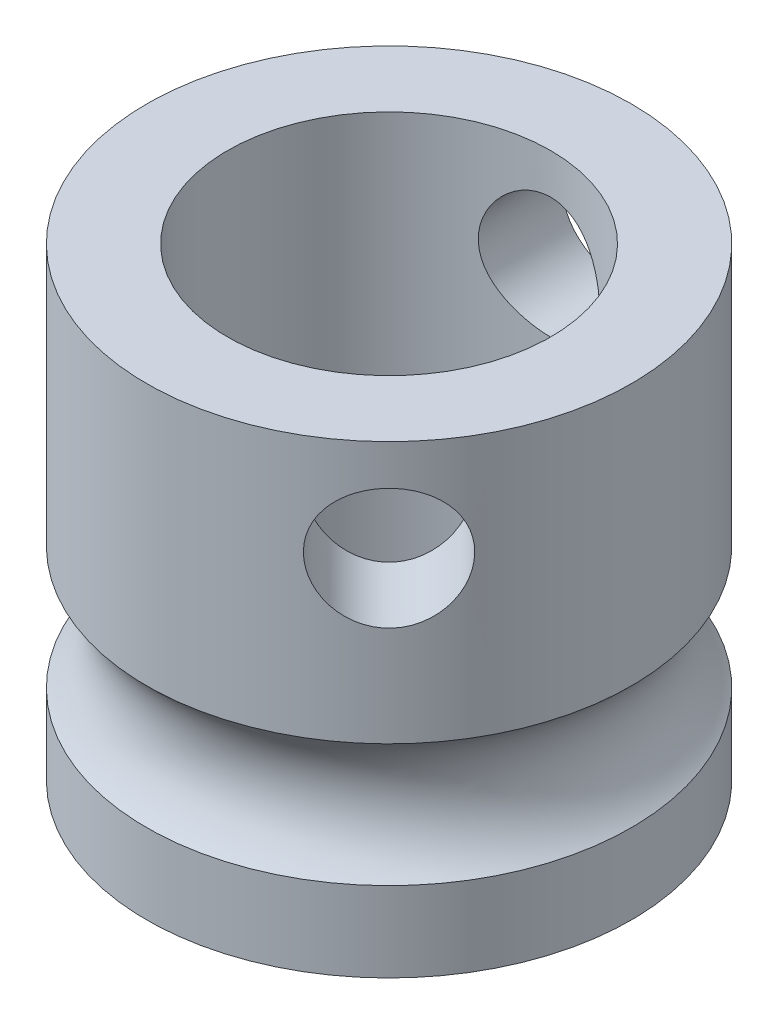
ISO-10303-21;
HEADER;
FILE_DESCRIPTION(('STEP AP214'),'2;1');
FILE_NAME('part.step','',(''),(''),'','','');
FILE_SCHEMA(('AUTOMOTIVE_DESIGN { 1 0 10303 214 1 1 1 1 }'));
ENDSEC;
DATA;
#1=APPLICATION_CONTEXT('core data for automotive mechanical design processes');
#2=APPLICATION_PROTOCOL_DEFINITION('international standard','automotive_design',2000,#1);
#3=PRODUCT_CONTEXT('',#1,'mechanical');
#4=PRODUCT('Part','Part','',(#3));
#5=PRODUCT_RELATED_PRODUCT_CATEGORY('part','',(#4));
#6=PRODUCT_DEFINITION_FORMATION('','',#4);
#7=PRODUCT_DEFINITION_CONTEXT('part definition',#1,'design');
#8=PRODUCT_DEFINITION('design','',#6,#7);
#9=PRODUCT_DEFINITION_SHAPE('','',#8);
#10=(LENGTH_UNIT() NAMED_UNIT(*) SI_UNIT(.MILLI.,.METRE.));
#11=(NAMED_UNIT(*) PLANE_ANGLE_UNIT() SI_UNIT($,.RADIAN.));
#12=(NAMED_UNIT(*) SI_UNIT($,.STERADIAN.) SOLID_ANGLE_UNIT());
#13=UNCERTAINTY_MEASURE_WITH_UNIT(LENGTH_MEASURE(1.E-05),#10,'distance_accuracy_value','');
#14=(GEOMETRIC_REPRESENTATION_CONTEXT(3) GLOBAL_UNCERTAINTY_ASSIGNED_CONTEXT((#13)) GLOBAL_UNIT_ASSIGNED_CONTEXT((#10,
#11,#12)) REPRESENTATION_CONTEXT('',''));
#15=CARTESIAN_POINT('',(0.,0.,0.));
#16=DIRECTION('',(0.,0.,1.));
#17=DIRECTION('',(1.,0.,0.));
#18=AXIS2_PLACEMENT_3D('',#15,#16,#17);
#19=CARTESIAN_POINT('',(0.,0.,0.));
#20=DIRECTION('',(0.,-1.,0.));
#21=DIRECTION('',(0.,0.,-1.));
#22=AXIS2_PLACEMENT_3D('',#19,#20,#21);
#23=CYLINDRICAL_SURFACE('',#22,4.);
#24=CARTESIAN_POINT('',(0.,8.,0.));
#25=DIRECTION('',(0.,-1.,0.));
#26=DIRECTION('',(0.,0.,-1.));
#27=AXIS2_PLACEMENT_3D('',#24,#25,#26);
#28=CIRCLE('',#27,4.);
#29=CARTESIAN_POINT('',(0.,8.,-4.));
#30=VERTEX_POINT('',#29);
#31=EDGE_CURVE('E65',#30,#30,#28,.T.);
#32=ORIENTED_EDGE('',*,*,#31,.F.);
#33=EDGE_LOOP('',(#32));
#34=FACE_BOUND('',#33,.T.);
#35=CARTESIAN_POINT('',(0.,7.,-4.));
#36=CARTESIAN_POINT('',(-0.0812350589378529,7.00000290230311,-4.00000217456151));
#37=CARTESIAN_POINT('',(-0.162450241781792,6.99338023975162,-3.99750379283184));
#38=CARTESIAN_POINT('',(-0.322453452352361,6.96717180473007,-3.98778696006928));
#39=CARTESIAN_POINT('',(-0.401241827987616,6.94758789952943,-3.98056918893993));
#40=CARTESIAN_POINT('',(-0.554060784990879,6.89624699822824,-3.96218832391545));
#41=CARTESIAN_POINT('',(-0.628100224162277,6.86451348317821,-3.9510328434944));
#42=CARTESIAN_POINT('',(-0.769799310160253,6.78989358698418,-3.92588767765353));
#43=CARTESIAN_POINT('',(-0.837457239177879,6.74700421445584,-3.91189723227548));
#44=CARTESIAN_POINT('',(-0.967346417045826,6.64938746892909,-3.88186246971217));
#45=CARTESIAN_POINT('',(-1.02927073015119,6.5942697377406,-3.86576002583566));
#46=CARTESIAN_POINT('',(-1.14324421474363,6.47458956534116,-3.83360220871327));
#47=CARTESIAN_POINT('',(-1.19529036359203,6.41002424391213,-3.81754685135033));
#48=CARTESIAN_POINT('',(-1.28998202215985,6.27028253247679,-3.78662470617731));
#49=CARTESIAN_POINT('',(-1.3321939319576,6.19479563345418,-3.77182648820818));
#50=CARTESIAN_POINT('',(-1.40318646334084,6.03715164583148,-3.74599860237433));
#51=CARTESIAN_POINT('',(-1.43197244961239,5.9549972368449,-3.73496742975881));
#52=CARTESIAN_POINT('',(-1.47408431017549,5.7898832597418,-3.71854412824136));
#53=CARTESIAN_POINT('',(-1.48799593218558,5.70709496156456,-3.71293924350838));
#54=CARTESIAN_POINT('',(-1.50179556531648,5.54018384200616,-3.70738061461215));
#55=CARTESIAN_POINT('',(-1.50168936802631,5.45606158612553,-3.70742453659305));
#56=CARTESIAN_POINT('',(-1.48790429610018,5.29423047478704,-3.71297511632055));
#57=CARTESIAN_POINT('',(-1.47503808509003,5.21643909395582,-3.71815468871122));
#58=CARTESIAN_POINT('',(-1.4374416786833,5.06421284959468,-3.73284938059529));
#59=CARTESIAN_POINT('',(-1.41270969663258,4.98977849338612,-3.74236515298863));
#60=CARTESIAN_POINT('',(-1.35163748571904,4.84472293227177,-3.76485702190253));
#61=CARTESIAN_POINT('',(-1.31508648737101,4.7742005138787,-3.77789517988166));
#62=CARTESIAN_POINT('',(-1.23156073762698,4.64005426240903,-3.80594210139319));
#63=CARTESIAN_POINT('',(-1.18458238728897,4.5764328224803,-3.82095154457158));
#64=CARTESIAN_POINT('',(-1.07781780766549,4.45339633634912,-3.85248038859113));
#65=CARTESIAN_POINT('',(-1.01738298716955,4.39455135925191,-3.86903347455671));
#66=CARTESIAN_POINT('',(-0.88731259081902,4.2876620337942,-3.90091728164085));
#67=CARTESIAN_POINT('',(-0.817675603497363,4.23961934539433,-3.91624781465952));
#68=CARTESIAN_POINT('',(-0.669723436992419,4.15506960293748,-3.9442639480908));
#69=CARTESIAN_POINT('',(-0.591290713844718,4.11875241877894,-3.95690498259616));
#70=CARTESIAN_POINT('',(-0.428836850524582,4.06001739572996,-3.97778718326962));
#71=CARTESIAN_POINT('',(-0.344818210845766,4.03759338343888,-3.98603030341493));
#72=CARTESIAN_POINT('',(-0.178375243148664,4.00837721245806,-3.99684443228065));
#73=CARTESIAN_POINT('',(-0.0961036195622086,4.00081739361749,-3.99969369025686));
#74=CARTESIAN_POINT('',(0.0685724752550249,3.99930893610008,-4.00025893700126));
#75=CARTESIAN_POINT('',(0.150976912983373,4.00535727968322,-3.99797606386863));
#76=CARTESIAN_POINT('',(0.31026204856186,4.03031004230867,-3.98871709772643));
#77=CARTESIAN_POINT('',(0.387233328007337,4.04871154373709,-3.98192470962305));
#78=CARTESIAN_POINT('',(0.536941754957222,4.09718607254732,-3.96451477091717));
#79=CARTESIAN_POINT('',(0.609678350347535,4.12726061794804,-3.9538967228203));
#80=CARTESIAN_POINT('',(0.751247765110156,4.19918641243947,-3.92949624407681));
#81=CARTESIAN_POINT('',(0.819903083557796,4.24135772922339,-3.91563000209348));
#82=CARTESIAN_POINT('',(0.949392711726626,4.33591810317156,-3.88626671564664));
#83=CARTESIAN_POINT('',(1.01022412027045,4.38831093254515,-3.87076907009516));
#84=CARTESIAN_POINT('',(1.12603079874454,4.50540412212428,-3.8387332949099));
#85=CARTESIAN_POINT('',(1.18046154123569,4.5706421827727,-3.82218696503729));
#86=CARTESIAN_POINT('',(1.27771050031903,4.70965138470766,-3.79078815746854));
#87=CARTESIAN_POINT('',(1.32052767414518,4.7834232913885,-3.77593583194399));
#88=CARTESIAN_POINT('',(1.39337773518998,4.93801598677231,-3.74966829822463));
#89=CARTESIAN_POINT('',(1.42335685446918,5.01886474591044,-3.73826760328493));
#90=CARTESIAN_POINT('',(1.46907883466889,5.18500976368782,-3.72054032891005));
#91=CARTESIAN_POINT('',(1.48483050305535,5.27030323619812,-3.71421061057491));
#92=CARTESIAN_POINT('',(1.50086347097839,5.43701615954111,-3.70775894792573));
#93=CARTESIAN_POINT('',(1.50207331495837,5.51833263171688,-3.70726444523341));
#94=CARTESIAN_POINT('',(1.49136715641593,5.67994531627616,-3.71158412745292));
#95=CARTESIAN_POINT('',(1.47945239850124,5.76024162467158,-3.71639780898899));
#96=CARTESIAN_POINT('',(1.44355815630242,5.91504722671655,-3.73048141585432));
#97=CARTESIAN_POINT('',(1.41995798316524,5.98965834624535,-3.73961085376663));
#98=CARTESIAN_POINT('',(1.3616969677992,6.13390550849442,-3.76121548297845));
#99=CARTESIAN_POINT('',(1.32703332944945,6.20354028807014,-3.77369151995215));
#100=CARTESIAN_POINT('',(1.24552075938154,6.33982678969763,-3.80139723903965));
#101=CARTESIAN_POINT('',(1.1981283280301,6.40613079679991,-3.81673698440964));
#102=CARTESIAN_POINT('',(1.09334485729906,6.5301415609712,-3.84806246757177));
#103=CARTESIAN_POINT('',(1.03595064012808,6.58784557478675,-3.86404840943145));
#104=CARTESIAN_POINT('',(0.909080396784622,6.69620195582184,-3.89590424609881));
#105=CARTESIAN_POINT('',(0.839118644212991,6.74630375343467,-3.91172104900645));
#106=CARTESIAN_POINT('',(0.691213223200819,6.83402265527656,-3.94054514457031));
#107=CARTESIAN_POINT('',(0.61326893409062,6.87163878773637,-3.95355221851559));
#108=CARTESIAN_POINT('',(0.447999082002311,6.93437682904833,-3.9757429260668));
#109=CARTESIAN_POINT('',(0.360413422234208,6.9588870646019,-3.98473657158356));
#110=CARTESIAN_POINT('',(0.181875733606382,6.99169295992068,-3.99686242179587));
#111=CARTESIAN_POINT('',(0.0909254163648591,6.99999675148732,-3.99999756603967));
#112=CARTESIAN_POINT('',(0.,7.,-4.));
#113=B_SPLINE_CURVE_WITH_KNOTS('',3,(#35,#36,#37,#38,#39,#40,#41,#42,#43,#44,#45,#46,#47,#48,
#49,#50,#51,#52,#53,#54,#55,#56,#57,#58,#59,#60,#61,#62,#63,#64,#65,#66,#67,#68,#69,#70,#71,#72,
#73,#74,#75,#76,#77,#78,#79,#80,#81,#82,#83,#84,#85,#86,#87,#88,#89,#90,#91,#92,#93,#94,#95,#96,
#97,#98,#99,#100,#101,#102,#103,#104,#105,#106,#107,#108,#109,#110,#111,#112),.UNSPECIFIED.,.T.,
.F.,(4,2,2,2,2,2,2,2,2,2,2,2,2,2,2,2,2,2,2,2,2,2,2,2,2,2,2,2,2,2,2,2,2,2,2,2,2,2,4),(0.,
0.24336980156056,0.486704549530461,0.729571369213573,0.97250337960949,1.22473618582715,
1.47704604925622,1.73896674501659,2.00078269352134,2.25185874416902,2.50283106079707,
2.73878345119971,2.97477138060589,3.21522408387018,3.45575990744258,3.71246153335813,
3.96920257905066,4.22991375286075,4.49050899698846,4.73725019635925,4.98393668390521,
5.2211443792384,5.45838293254454,5.702592218596,5.94689180019868,6.20536519455658,
6.46386178920141,6.72343066727204,6.98283874956507,7.22558763480252,7.46831350211259,
7.70363142426534,7.93900886656507,8.18672471884271,8.43451941997062,8.69572329654039,
8.95694749805102,9.22948515032042,9.50188601796127),.UNSPECIFIED.);
#114=CARTESIAN_POINT('',(0.,7.,-4.));
#115=VERTEX_POINT('',#114);
#116=EDGE_CURVE('E68',#115,#115,#113,.T.);
#117=ORIENTED_EDGE('',*,*,#116,.F.);
#118=EDGE_LOOP('',(#117));
#119=FACE_BOUND('',#118,.T.);
#120=CARTESIAN_POINT('',(1.56136194864554,5.5,3.68268229220521));
#121=CARTESIAN_POINT('',(1.56135779208035,5.58100748372079,3.68268243634986));
#122=CARTESIAN_POINT('',(1.56791497826831,5.66199492250364,3.67992410507783));
#123=CARTESIAN_POINT('',(1.59367706127285,5.8215280829132,3.66884013139985));
#124=CARTESIAN_POINT('',(1.6128815792934,5.90007387759501,3.66051465573348));
#125=CARTESIAN_POINT('',(1.66266134710063,6.05237537161353,3.63817143026194));
#126=CARTESIAN_POINT('',(1.69320934739937,6.12614205665108,3.6241673144158));
#127=CARTESIAN_POINT('',(1.76402832005993,6.26737189681884,3.59022855145938));
#128=CARTESIAN_POINT('',(1.80430221263119,6.33483315028252,3.5702921227477));
#129=CARTESIAN_POINT('',(1.89474150454269,6.46489031162282,3.52316120631594));
#130=CARTESIAN_POINT('',(1.94527169042746,6.52712852962939,3.49567941002739));
#131=CARTESIAN_POINT('',(2.05280287486073,6.64172281467149,3.43363511372078));
#132=CARTESIAN_POINT('',(2.10980524955819,6.69407677374186,3.39907110658607));
#133=CARTESIAN_POINT('',(2.23009746766653,6.78913951229561,3.32143851502955));
#134=CARTESIAN_POINT('',(2.29353525591582,6.83145947471586,3.2781205633425));
#135=CARTESIAN_POINT('',(2.42242359918014,6.90265117252491,3.18405647598774));
#136=CARTESIAN_POINT('',(2.4878734477221,6.93152757199197,3.1333129245826));
#137=CARTESIAN_POINT('',(2.61537417527733,6.97375789577462,3.02760235556394));
#138=CARTESIAN_POINT('',(2.67744989555346,6.98772762744046,2.97291191464347));
#139=CARTESIAN_POINT('',(2.79885293324627,7.00172120094499,2.85890661244243));
#140=CARTESIAN_POINT('',(2.85818113809423,7.00174957761871,2.79959326117797));
#141=CARTESIAN_POINT('',(2.96937910498948,6.98821823853483,2.68124222314178));
#142=CARTESIAN_POINT('',(3.0214726487727,6.97533070205119,2.62233607452958));
#143=CARTESIAN_POINT('',(3.12030098191268,6.93746408477445,2.5039312488251));
#144=CARTESIAN_POINT('',(3.1670353915079,6.91248414773796,2.44443253006613));
#145=CARTESIAN_POINT('',(3.25507181620702,6.85082954832415,2.32594903760683));
#146=CARTESIAN_POINT('',(3.29628488300286,6.81398999473159,2.26698434219066));
#147=CARTESIAN_POINT('',(3.37219203456641,6.72980790307061,2.15245177622769));
#148=CARTESIAN_POINT('',(3.40688400977845,6.6824619769824,2.09688500881012));
#149=CARTESIAN_POINT('',(3.47162261343371,6.57537271371681,1.98798461884326));
#150=CARTESIAN_POINT('',(3.50127867151368,6.51506608434957,1.93497189192805));
#151=CARTESIAN_POINT('',(3.55358532534339,6.38540700667844,1.8371487304959));
#152=CARTESIAN_POINT('',(3.57623416220865,6.31605229341336,1.79234035650606));
#153=CARTESIAN_POINT('',(3.61528363828264,6.16828053253718,1.71223850580146));
#154=CARTESIAN_POINT('',(3.63153443487212,6.08969650631393,1.67717829618631));
#155=CARTESIAN_POINT('',(3.65736064786832,5.92690377483243,1.62009459026146));
#156=CARTESIAN_POINT('',(3.66693977917435,5.84269822840631,1.59806383995466));
#157=CARTESIAN_POINT('',(3.67928722207547,5.67602403768405,1.56941929718694));
#158=CARTESIAN_POINT('',(3.68240215096391,5.59371589446386,1.56202196019031));
#159=CARTESIAN_POINT('',(3.68292624974755,5.42899064325826,1.56078727966911));
#160=CARTESIAN_POINT('',(3.68033684547876,5.34657356764753,1.56694654758067));
#161=CARTESIAN_POINT('',(3.6696658054887,5.18807007771232,1.59176558688802));
#162=CARTESIAN_POINT('',(3.66185071568455,5.11186886423534,1.60981809211476));
#163=CARTESIAN_POINT('',(3.64086638246479,4.9636520552798,1.65672794151804));
#164=CARTESIAN_POINT('',(3.62769604205964,4.89163732083186,1.6855874993558));
#165=CARTESIAN_POINT('',(3.59518921978222,4.75083556192379,1.75387902817586));
#166=CARTESIAN_POINT('',(3.57564011209578,4.68227070786266,1.79366674499548));
#167=CARTESIAN_POINT('',(3.53025982383456,4.55287101827396,1.88140959407388));
#168=CARTESIAN_POINT('',(3.50442634320998,4.49203902537537,1.92936771473035));
#169=CARTESIAN_POINT('',(3.44435800648028,4.3758316268049,2.03477268299013));
#170=CARTESIAN_POINT('',(3.40969437951775,4.32104659123125,2.09262832065705));
#171=CARTESIAN_POINT('',(3.33280371988308,4.22316163241056,2.21303299667708));
#172=CARTESIAN_POINT('',(3.29057666268625,4.18006174705416,2.27558205024835));
#173=CARTESIAN_POINT('',(3.19892716834268,4.10705394380039,2.40270183937087));
#174=CARTESIAN_POINT('',(3.14953014519998,4.0771008762074,2.46726482700423));
#175=CARTESIAN_POINT('',(3.04421932386557,4.03134358615008,2.59608066085983));
#176=CARTESIAN_POINT('',(2.98830860215069,4.0155327145776,2.66033363868844));
#177=CARTESIAN_POINT('',(2.87482723021146,3.99922559724517,2.78242875941168));
#178=CARTESIAN_POINT('',(2.81754322507732,3.99789051694101,2.84042628671861));
#179=CARTESIAN_POINT('',(2.70017358995767,4.00841515944539,2.95222432848033));
#180=CARTESIAN_POINT('',(2.64008829870139,4.02027329088586,3.0060253482812));
#181=CARTESIAN_POINT('',(2.52059713080318,4.05625885149362,3.10685688591615));
#182=CARTESIAN_POINT('',(2.46121043901646,4.08007990587836,3.1540205549749));
#183=CARTESIAN_POINT('',(2.34360810233065,4.13901001338436,3.24236270335427));
#184=CARTESIAN_POINT('',(2.28539268132715,4.17412120330475,3.28354004754419));
#185=CARTESIAN_POINT('',(2.16966241000934,4.25631394350481,3.3611941551591));
#186=CARTESIAN_POINT('',(2.11227987888107,4.30383664051415,3.39740056082675));
#187=CARTESIAN_POINT('',(2.00293492071445,4.40880783018761,3.46299353561127));
#188=CARTESIAN_POINT('',(1.95097443900516,4.46625986580788,3.49237766162307));
#189=CARTESIAN_POINT('',(1.85196155991807,4.59306413164506,3.54592373682155));
#190=CARTESIAN_POINT('',(1.80531294795896,4.66288440215431,3.56972821218074));
#191=CARTESIAN_POINT('',(1.72260839471799,4.81041586957333,3.61036726096523));
#192=CARTESIAN_POINT('',(1.68655355244099,4.88812788405348,3.62720111132724));
#193=CARTESIAN_POINT('',(1.6258957557525,5.0529556809754,3.65480978672137));
#194=CARTESIAN_POINT('',(1.60186414851797,5.14033436651178,3.66528662983953));
#195=CARTESIAN_POINT('',(1.56960478615232,5.31848527195579,3.67922048622757));
#196=CARTESIAN_POINT('',(1.56136660484033,5.40925521270999,3.68268213073401));
#197=CARTESIAN_POINT('',(1.56136194864554,5.5,3.68268229220521));
#198=B_SPLINE_CURVE_WITH_KNOTS('',3,(#120,#121,#122,#123,#124,#125,#126,#127,#128,#129,#130,
#131,#132,#133,#134,#135,#136,#137,#138,#139,#140,#141,#142,#143,#144,#145,#146,#147,#148,#149,
#150,#151,#152,#153,#154,#155,#156,#157,#158,#159,#160,#161,#162,#163,#164,#165,#166,#167,#168,
#169,#170,#171,#172,#173,#174,#175,#176,#177,#178,#179,#180,#181,#182,#183,#184,#185,#186,#187,
#188,#189,#190,#191,#192,#193,#194,#195,#196,#197),.UNSPECIFIED.,.T.,.F.,(4,2,2,2,2,2,2,2,2,2,2,
2,2,2,2,2,2,2,2,2,2,2,2,2,2,2,2,2,2,2,2,2,2,2,2,2,2,2,4),(0.,0.24268454141617,0.485361814598855,
0.727459856757031,0.969630679682934,1.22274652401128,1.47591628822983,1.73770072136421,
1.9993942638133,2.24980018489679,2.50012465404857,2.73806472803194,2.97602165263335,
3.21744131210668,3.45893893628976,3.71456675065875,3.97025867827335,4.23162592252966,
4.49284751635474,4.73965657740485,4.98640395388884,5.22143845928199,5.45652113429526,
5.70041561005821,5.94439948466355,6.20385016993624,6.46330169650178,6.72185508890168,
6.98028685560127,7.22365720549936,7.4669982031948,7.7044027400389,7.94185223512831,
8.18928323676987,8.43680270894965,8.69738599542079,8.95799630544243,9.23003178870926,
9.50188762323053),.UNSPECIFIED.);
#199=CARTESIAN_POINT('',(1.56136194864554,5.5,3.68268229220521));
#200=VERTEX_POINT('',#199);
#201=EDGE_CURVE('E51',#200,#200,#198,.T.);
#202=ORIENTED_EDGE('',*,*,#201,.F.);
#203=EDGE_LOOP('',(#202));
#204=FACE_BOUND('',#203,.T.);
#205=CARTESIAN_POINT('',(0.,-3.5,0.));
#206=DIRECTION('',(0.,-1.,0.));
#207=DIRECTION('',(0.,0.,-1.));
#208=AXIS2_PLACEMENT_3D('',#205,#206,#207);
#209=CIRCLE('',#208,4.);
#210=CARTESIAN_POINT('',(0.,-3.5,-4.));
#211=VERTEX_POINT('',#210);
#212=EDGE_CURVE('E128',#211,#211,#209,.T.);
#213=ORIENTED_EDGE('',*,*,#212,.T.);
#214=EDGE_LOOP('',(#213));
#215=FACE_BOUND('',#214,.T.);
#216=ADVANCED_FACE('F47',(#34,#119,#204,#215),#23,.F.);
#217=CARTESIAN_POINT('',(0.,0.,0.));
#218=DIRECTION('',(0.,-1.,0.));
#219=DIRECTION('',(0.,0.,-1.));
#220=AXIS2_PLACEMENT_3D('',#217,#218,#219);
#221=CYLINDRICAL_SURFACE('',#220,6.);
#222=CARTESIAN_POINT('',(0.,-1.51986841535706,0.));
#223=DIRECTION('',(0.,-1.,0.));
#224=DIRECTION('',(0.,0.,-1.));
#225=AXIS2_PLACEMENT_3D('',#222,#223,#224);
#226=CIRCLE('',#225,6.);
#227=CARTESIAN_POINT('',(0.,-1.51986841535706,-6.));
#228=VERTEX_POINT('',#227);
#229=EDGE_CURVE('E96',#228,#228,#226,.T.);
#230=ORIENTED_EDGE('',*,*,#229,.T.);
#231=EDGE_LOOP('',(#230));
#232=FACE_BOUND('',#231,.T.);
#233=CARTESIAN_POINT('',(0.,-3.5,0.));
#234=DIRECTION('',(0.,-1.,0.));
#235=DIRECTION('',(0.,0.,-1.));
#236=AXIS2_PLACEMENT_3D('',#233,#234,#235);
#237=CIRCLE('',#236,6.);
#238=CARTESIAN_POINT('',(0.,-3.5,-6.));
#239=VERTEX_POINT('',#238);
#240=EDGE_CURVE('E130',#239,#239,#237,.T.);
#241=ORIENTED_EDGE('',*,*,#240,.F.);
#242=EDGE_LOOP('',(#241));
#243=FACE_BOUND('',#242,.T.);
#244=ADVANCED_FACE('F87',(#232,#243),#221,.T.);
#245=CARTESIAN_POINT('',(0.,0.,0.));
#246=DIRECTION('',(0.,-1.,0.));
#247=DIRECTION('',(0.,0.,-1.));
#248=AXIS2_PLACEMENT_3D('',#245,#246,#247);
#249=TOROIDAL_SURFACE('',#248,7.3,2.);
#250=ORIENTED_EDGE('',*,*,#229,.F.);
#251=EDGE_LOOP('',(#250));
#252=FACE_BOUND('',#251,.T.);
#253=CARTESIAN_POINT('',(0.,1.51986841535706,0.));
#254=DIRECTION('',(0.,-1.,0.));
#255=DIRECTION('',(0.,0.,-1.));
#256=AXIS2_PLACEMENT_3D('',#253,#254,#255);
#257=CIRCLE('',#256,6.);
#258=CARTESIAN_POINT('',(0.,1.51986841535706,-6.));
#259=VERTEX_POINT('',#258);
#260=EDGE_CURVE('E10',#259,#259,#257,.T.);
#261=ORIENTED_EDGE('',*,*,#260,.T.);
#262=EDGE_LOOP('',(#261));
#263=FACE_BOUND('',#262,.T.);
#264=ADVANCED_FACE('F49',(#252,#263),#249,.F.);
#265=CARTESIAN_POINT('',(0.,0.,0.));
#266=DIRECTION('',(0.,-1.,0.));
#267=DIRECTION('',(0.,0.,-1.));
#268=AXIS2_PLACEMENT_3D('',#265,#266,#267);
#269=CYLINDRICAL_SURFACE('',#268,6.);
#270=CARTESIAN_POINT('',(3.0472590095089,5.5,5.16857935306858));
#271=CARTESIAN_POINT('',(3.04726179129926,5.58283045055476,5.16857880743373));
#272=CARTESIAN_POINT('',(3.05339320996121,5.6656869392068,5.16497774998346));
#273=CARTESIAN_POINT('',(3.07760964290111,5.82902054690442,5.15058350523465));
#274=CARTESIAN_POINT('',(3.09570161407527,5.909496252681,5.13978613214472));
#275=CARTESIAN_POINT('',(3.14290411720998,6.06568212291222,5.11105766460475));
#276=CARTESIAN_POINT('',(3.17200042396869,6.1413982932314,5.0931357784242));
#277=CARTESIAN_POINT('',(3.23987592066889,6.28618651152395,5.0502286408179));
#278=CARTESIAN_POINT('',(3.27865552169787,6.35525827724814,5.02524308951052));
#279=CARTESIAN_POINT('',(3.36513477763622,6.48631698715732,4.96775702159995));
#280=CARTESIAN_POINT('',(3.41299615668821,6.54813616021003,4.93511722985398));
#281=CARTESIAN_POINT('',(3.51521732424161,6.66145683661621,4.86283449298297));
#282=CARTESIAN_POINT('',(3.56957771952008,6.71295737537305,4.82319089378598));
#283=CARTESIAN_POINT('',(3.68357050948841,6.80486528057877,4.73671713523254));
#284=CARTESIAN_POINT('',(3.74326588256113,6.84510783289688,4.68979441760644));
#285=CARTESIAN_POINT('',(3.8650647302576,6.91228578649185,4.58993107889536));
#286=CARTESIAN_POINT('',(3.92716784812283,6.93922315114931,4.53699134713045));
#287=CARTESIAN_POINT('',(4.05031704562695,6.97848870074715,4.42736795554064));
#288=CARTESIAN_POINT('',(4.11135905215039,6.99110178659595,4.37078186721885));
#289=CARTESIAN_POINT('',(4.2316552692678,7.00225502756533,4.25442027730616));
#290=CARTESIAN_POINT('',(4.29090974288232,7.00079726332576,4.19464524856));
#291=CARTESIAN_POINT('',(4.40460840301037,6.98405508984991,4.07505652066592));
#292=CARTESIAN_POINT('',(4.45913015207185,6.96907820496769,4.01527311130792));
#293=CARTESIAN_POINT('',(4.56349207925854,6.9262172379709,3.89625569619234));
#294=CARTESIAN_POINT('',(4.61333200800196,6.89833246877355,3.83702171985213));
#295=CARTESIAN_POINT('',(4.7078003567481,6.83019845758776,3.72052364858073));
#296=CARTESIAN_POINT('',(4.75237761936196,6.78983977320295,3.66328218831906));
#297=CARTESIAN_POINT('',(4.83516283417216,6.69798659253024,3.55330066338416));
#298=CARTESIAN_POINT('',(4.87336967620237,6.64649015886363,3.50056138408088));
#299=CARTESIAN_POINT('',(4.94397983534538,6.53217475481057,3.40013796920521));
#300=CARTESIAN_POINT('',(4.97619809554032,6.46908706459134,3.35262928081855));
#301=CARTESIAN_POINT('',(5.03329554632488,6.33424001587585,3.26628581428999));
#302=CARTESIAN_POINT('',(5.05817439390222,6.2624802523054,3.22745144156855));
#303=CARTESIAN_POINT('',(5.10057700367377,6.11182597951062,3.16001833553131));
#304=CARTESIAN_POINT('',(5.11806451683604,6.03289856181208,3.13147014689023));
#305=CARTESIAN_POINT('',(5.14543239111894,5.87044871915413,3.0862972368623));
#306=CARTESIAN_POINT('',(5.15531438013973,5.78692728161012,3.06966996395323));
#307=CARTESIAN_POINT('',(5.16727467043343,5.62002429908613,3.04949299580966));
#308=CARTESIAN_POINT('',(5.16955219029706,5.53669732400222,3.04560949265868));
#309=CARTESIAN_POINT('',(5.16685347221116,5.3705068380531,3.05018561647688));
#310=CARTESIAN_POINT('',(5.16187790199609,5.28764328522925,3.05864410721667));
#311=CARTESIAN_POINT('',(5.14483665245067,5.12613144102717,3.08721916514401));
#312=CARTESIAN_POINT('',(5.13288831016048,5.04743636405749,3.10714272394878));
#313=CARTESIAN_POINT('',(5.10204070347091,4.89494112528899,3.15753828094415));
#314=CARTESIAN_POINT('',(5.08314061566232,4.8211415445668,3.18801152868223));
#315=CARTESIAN_POINT('',(5.03802212967452,4.67893523327959,3.25885322020538));
#316=CARTESIAN_POINT('',(5.01166744013403,4.61066269597414,3.29940405288485));
#317=CARTESIAN_POINT('',(4.9519345056206,4.48288698231919,3.38839351178875));
#318=CARTESIAN_POINT('',(4.91855510627883,4.42338525000995,3.43683343412912));
#319=CARTESIAN_POINT('',(4.84409051216509,4.31331337445743,3.54104250584993));
#320=CARTESIAN_POINT('',(4.80283340641338,4.26300396247071,3.59696471517196));
#321=CARTESIAN_POINT('',(4.71367090592626,4.17463847982925,3.71303840901443));
#322=CARTESIAN_POINT('',(4.66576585815498,4.13658177003508,3.77318967273463));
#323=CARTESIAN_POINT('',(4.564485993328,4.07413237928324,3.89508596041879));
#324=CARTESIAN_POINT('',(4.51115391721379,4.04964142937256,3.95681604071366));
#325=CARTESIAN_POINT('',(4.39992697454511,4.01472379923495,4.08013844119413));
#326=CARTESIAN_POINT('',(4.3420329908435,4.00429440475657,4.14173078567419));
#327=CARTESIAN_POINT('',(4.22488329233747,3.9979486156367,4.26112292452148));
#328=CARTESIAN_POINT('',(4.16570672173828,4.00164743635691,4.31898023478141));
#329=CARTESIAN_POINT('',(4.0463034399394,4.0225717409415,4.43104199974452));
#330=CARTESIAN_POINT('',(3.98607676002323,4.03979682251965,4.48524656303244));
#331=CARTESIAN_POINT('',(3.86683106769661,4.08707832965639,4.58844280589975));
#332=CARTESIAN_POINT('',(3.80780729936725,4.11706517997194,4.63746097753893));
#333=CARTESIAN_POINT('',(3.69257790554327,4.18895586852899,4.72972759647341));
#334=CARTESIAN_POINT('',(3.6363726363499,4.23086120900435,4.77297531543745));
#335=CARTESIAN_POINT('',(3.527406316351,4.32657285099561,4.8540841500181));
#336=CARTESIAN_POINT('',(3.47476003800113,4.38064021436107,4.89179139607909));
#337=CARTESIAN_POINT('',(3.37639047767242,4.4986342779607,4.96020010898107));
#338=CARTESIAN_POINT('',(3.33066895411611,4.56256347414686,4.99089979737344));
#339=CARTESIAN_POINT('',(3.24722462036311,4.699902121302,5.04559945363089));
#340=CARTESIAN_POINT('',(3.20966694673863,4.77346618511894,5.06946374710747));
#341=CARTESIAN_POINT('',(3.145401166194,4.92708323488405,5.1095887286339));
#342=CARTESIAN_POINT('',(3.11868516637614,5.00713144916011,5.12585494949999));
#343=CARTESIAN_POINT('',(3.08132021512811,5.15586551774007,5.14838254819684));
#344=CARTESIAN_POINT('',(3.06858900563295,5.22383974657579,5.15595373634073));
#345=CARTESIAN_POINT('',(3.05155759691768,5.36120330349994,5.16605215225342));
#346=CARTESIAN_POINT('',(3.04725667851728,5.43059251036759,5.16857981028142));
#347=CARTESIAN_POINT('',(3.0472590095089,5.5,5.16857935306858));
#348=B_SPLINE_CURVE_WITH_KNOTS('',3,(#270,#271,#272,#273,#274,#275,#276,#277,#278,#279,#280,
#281,#282,#283,#284,#285,#286,#287,#288,#289,#290,#291,#292,#293,#294,#295,#296,#297,#298,#299,
#300,#301,#302,#303,#304,#305,#306,#307,#308,#309,#310,#311,#312,#313,#314,#315,#316,#317,#318,
#319,#320,#321,#322,#323,#324,#325,#326,#327,#328,#329,#330,#331,#332,#333,#334,#335,#336,#337,
#338,#339,#340,#341,#342,#343,#344,#345,#346,#347),.UNSPECIFIED.,.T.,.F.,(4,2,2,2,2,2,2,2,2,2,2,
2,2,2,2,2,2,2,2,2,2,2,2,2,2,2,2,2,2,2,2,2,2,2,2,2,2,2,4),(0.,0.248236465041681,0.4966174448572,
0.744678436299613,0.992749960532871,1.24574372515786,1.4987611288792,1.75530897838752,
2.01181895908255,2.26313250597208,2.51440889199612,2.76010957613368,3.00582334034872,
3.25375724552667,3.50173431281348,3.75642279943147,4.01112318719881,4.26705859205041,
4.52293920077729,4.7720614485703,5.02116076310281,5.26618443005524,5.51123712852851,
5.76109707515494,6.01099811331027,6.26715198579191,6.52329249431732,6.77755243684158,
7.03176329345423,7.27910067676474,7.52643070426189,7.77242925935826,8.01845883442843,
8.27038257949243,8.52237018939305,8.77905886370806,9.03556032819972,9.24358696306398,
9.45159585059712),.UNSPECIFIED.);
#349=CARTESIAN_POINT('',(3.0472590095089,5.5,5.16857935306858));
#350=VERTEX_POINT('',#349);
#351=EDGE_CURVE('E75',#350,#350,#348,.T.);
#352=ORIENTED_EDGE('',*,*,#351,.T.);
#353=EDGE_LOOP('',(#352));
#354=FACE_BOUND('',#353,.T.);
#355=CARTESIAN_POINT('',(0.,7.,-6.));
#356=CARTESIAN_POINT('',(-0.0828760886697311,6.99999767426184,-5.99999859868013));
#357=CARTESIAN_POINT('',(-0.165778157830763,6.99310844922621,-5.99826578131828));
#358=CARTESIAN_POINT('',(-0.329206323770533,6.965774848693,-5.99152113829892));
#359=CARTESIAN_POINT('',(-0.409731046870739,6.94532279046215,-5.98650745419968));
#360=CARTESIAN_POINT('',(-0.566020872182577,6.89156074653791,-5.9737562633204));
#361=CARTESIAN_POINT('',(-0.641791563430003,6.85826620128472,-5.96602202842087));
#362=CARTESIAN_POINT('',(-0.786672131904427,6.77981860995517,-5.94865343807593));
#363=CARTESIAN_POINT('',(-0.855781784348759,6.73466516388106,-5.9390190185405));
#364=CARTESIAN_POINT('',(-0.98680192730092,6.63279921034579,-5.91867413591801));
#365=CARTESIAN_POINT('',(-1.04855569006107,6.57588842504082,-5.90794707148533));
#366=CARTESIAN_POINT('',(-1.1617489272033,6.45254779509108,-5.8867362011753));
#367=CARTESIAN_POINT('',(-1.21318723694913,6.3861168770535,-5.87625242288348));
#368=CARTESIAN_POINT('',(-1.30502654279903,6.24440477326256,-5.8565477569971));
#369=CARTESIAN_POINT('',(-1.34525221592536,6.1690067691896,-5.84734794470605));
#370=CARTESIAN_POINT('',(-1.41239690855053,6.01225158834164,-5.83149494812223));
#371=CARTESIAN_POINT('',(-1.43931805543933,5.93089536667424,-5.82484135672789));
#372=CARTESIAN_POINT('',(-1.47855483680429,5.76625650179752,-5.81500476717551));
#373=CARTESIAN_POINT('',(-1.49115226833334,5.6830451039502,-5.81175491075426));
#374=CARTESIAN_POINT('',(-1.50226177506785,5.51563143098602,-5.80889362537741));
#375=CARTESIAN_POINT('',(-1.50077614181798,5.43142931930139,-5.80928160448644));
#376=CARTESIAN_POINT('',(-1.48398652463928,5.26658419225552,-5.81359205496618));
#377=CARTESIAN_POINT('',(-1.46901834019052,5.1859043785349,-5.81742863001879));
#378=CARTESIAN_POINT('',(-1.42622418690311,5.02823894908871,-5.82806709676484));
#379=CARTESIAN_POINT('',(-1.39839730206942,4.95125359697102,-5.83486919970696));
#380=CARTESIAN_POINT('',(-1.33038947793715,4.80226198374793,-5.85075113904186));
#381=CARTESIAN_POINT('',(-1.29008666723291,4.73031382821045,-5.85985327469421));
#382=CARTESIAN_POINT('',(-1.19835627601495,4.59408129024316,-5.87929710846386));
#383=CARTESIAN_POINT('',(-1.14692674880884,4.52979825193274,-5.88963902334735));
#384=CARTESIAN_POINT('',(-1.03266342468122,4.4087963843056,-5.91075880539781));
#385=CARTESIAN_POINT('',(-0.96954625816586,4.35234550993865,-5.92154069477971));
#386=CARTESIAN_POINT('',(-0.8346119175037,4.2507787575361,-5.94205965578786));
#387=CARTESIAN_POINT('',(-0.762794477707944,4.20566322573643,-5.95179669549415));
#388=CARTESIAN_POINT('',(-0.612115888681392,4.12794941377561,-5.96917732094183));
#389=CARTESIAN_POINT('',(-0.533231393208624,4.09539465974557,-5.97681360127725));
#390=CARTESIAN_POINT('',(-0.370876008142883,4.04408269429043,-5.98907916991419));
#391=CARTESIAN_POINT('',(-0.287405999150485,4.02532284358186,-5.99370903339281));
#392=CARTESIAN_POINT('',(-0.120539970390027,4.00254243444116,-5.99935499271375));
#393=CARTESIAN_POINT('',(-0.0371967199882104,3.9981569739247,-6.00046053508279));
#394=CARTESIAN_POINT('',(0.129032874801507,4.00324900205549,-5.99918804814451));
#395=CARTESIAN_POINT('',(0.211919259644594,4.01272524279913,-5.99681033241846));
#396=CARTESIAN_POINT('',(0.373614268776491,4.04497090839138,-5.98889581127357));
#397=CARTESIAN_POINT('',(0.452465118968754,4.06754126347699,-5.98340634185811));
#398=CARTESIAN_POINT('',(0.60525729245251,4.12510708402845,-5.96988706634134));
#399=CARTESIAN_POINT('',(0.679198119032634,4.16010380431317,-5.96185700369892));
#400=CARTESIAN_POINT('',(0.821523134429847,4.24223612887473,-5.9439330792631));
#401=CARTESIAN_POINT('',(0.88978544183583,4.28957611239676,-5.93400867366932));
#402=CARTESIAN_POINT('',(1.01752661364325,4.39478990879697,-5.91344509187419));
#403=CARTESIAN_POINT('',(1.07700395897301,4.45266553961691,-5.90280579251705));
#404=CARTESIAN_POINT('',(1.18699056807273,4.57900196084446,-5.88168956960771));
#405=CARTESIAN_POINT('',(1.23724386762203,4.64768770300242,-5.87122304187281));
#406=CARTESIAN_POINT('',(1.3255107590127,4.79273263446572,-5.85192878377239));
#407=CARTESIAN_POINT('',(1.36352489415794,4.86909148295975,-5.84310098067026));
#408=CARTESIAN_POINT('',(1.42595142060929,5.02690572241308,-5.82818094734665));
#409=CARTESIAN_POINT('',(1.45044439665406,5.10832762834401,-5.82207255291906));
#410=CARTESIAN_POINT('',(1.48534565995378,5.27430963788911,-5.81326744090183));
#411=CARTESIAN_POINT('',(1.49575702747866,5.35886905103249,-5.81056997719936));
#412=CARTESIAN_POINT('',(1.50203859033399,5.5261210238552,-5.80894901203957));
#413=CARTESIAN_POINT('',(1.49831789778012,5.60879743512473,-5.80991932728264));
#414=CARTESIAN_POINT('',(1.47737727831287,5.77230388866798,-5.81527909007843));
#415=CARTESIAN_POINT('',(1.46015762268677,5.85313396801365,-5.81966846891857));
#416=CARTESIAN_POINT('',(1.41293131944279,6.01020845906541,-5.83131260682722));
#417=CARTESIAN_POINT('',(1.38300140468038,6.08647730524021,-5.83855015236309));
#418=CARTESIAN_POINT('',(1.31126491360507,6.23296538271369,-5.85507755724829));
#419=CARTESIAN_POINT('',(1.26945669003419,6.30318377318691,-5.86436770120773));
#420=CARTESIAN_POINT('',(1.17386774863714,6.43755462900202,-5.88425634263512));
#421=CARTESIAN_POINT('',(1.11980316291226,6.50150107342396,-5.89488264831757));
#422=CARTESIAN_POINT('',(1.00178937118974,6.61954704479541,-5.91608027246286));
#423=CARTESIAN_POINT('',(0.937837821261147,6.67364423011297,-5.9266515772706));
#424=CARTESIAN_POINT('',(0.800467586702591,6.77141130856461,-5.94677655647663));
#425=CARTESIAN_POINT('',(0.726898422316387,6.81487461367158,-5.95630833365868));
#426=CARTESIAN_POINT('',(0.573266059510477,6.88874746294053,-5.97304924975118));
#427=CARTESIAN_POINT('',(0.49320756343674,6.91916636064854,-5.98026005199781));
#428=CARTESIAN_POINT('',(0.344410253243473,6.96157183032965,-5.99048059565542));
#429=CARTESIAN_POINT('',(0.27638017090807,6.97595124305343,-5.99402585052691));
#430=CARTESIAN_POINT('',(0.138906071536284,6.99516594362194,-5.99878605231948));
#431=CARTESIAN_POINT('',(0.0694621612426168,7.0000019493053,-6.00000117450894));
#432=CARTESIAN_POINT('',(0.,7.,-6.));
#433=B_SPLINE_CURVE_WITH_KNOTS('',3,(#355,#356,#357,#358,#359,#360,#361,#362,#363,#364,#365,
#366,#367,#368,#369,#370,#371,#372,#373,#374,#375,#376,#377,#378,#379,#380,#381,#382,#383,#384,
#385,#386,#387,#388,#389,#390,#391,#392,#393,#394,#395,#396,#397,#398,#399,#400,#401,#402,#403,
#404,#405,#406,#407,#408,#409,#410,#411,#412,#413,#414,#415,#416,#417,#418,#419,#420,#421,#422,
#423,#424,#425,#426,#427,#428,#429,#430,#431,#432),.UNSPECIFIED.,.T.,.F.,(4,2,2,2,2,2,2,2,2,2,2,
2,2,2,2,2,2,2,2,2,2,2,2,2,2,2,2,2,2,2,2,2,2,2,2,2,2,2,4),(0.,0.24837371247189,0.4968882377639,
0.745104902286106,0.993329940169328,1.24614435437139,1.49898729580062,1.75558647545807,
2.01214461169368,2.2635629509943,2.51494038112697,2.76022497007018,3.00552703466038,
3.25330527873879,3.50112690836163,3.75601500969019,4.01091089558247,4.26668229009114,
4.52240473688643,4.77158308949276,5.02073901112743,5.26620274514037,5.5116912732229,
5.76153587565352,6.01142363008019,6.26744509204476,6.52345518749508,6.77792254614036,
7.03233423252408,7.27943780398612,7.52653640956034,7.77216400559447,8.01782568136901,
8.2698957640991,8.52202569770417,8.77872185499588,9.0352336382135,9.24342242942149,
9.45159556043039),.UNSPECIFIED.);
#434=CARTESIAN_POINT('',(0.,7.,-6.));
#435=VERTEX_POINT('',#434);
#436=EDGE_CURVE('E74',#435,#435,#433,.T.);
#437=ORIENTED_EDGE('',*,*,#436,.T.);
#438=EDGE_LOOP('',(#437));
#439=FACE_BOUND('',#438,.T.);
#440=ORIENTED_EDGE('',*,*,#260,.F.);
#441=EDGE_LOOP('',(#440));
#442=FACE_BOUND('',#441,.T.);
#443=CARTESIAN_POINT('',(0.,8.,0.));
#444=DIRECTION('',(0.,-1.,0.));
#445=DIRECTION('',(0.,0.,-1.));
#446=AXIS2_PLACEMENT_3D('',#443,#444,#445);
#447=CIRCLE('',#446,6.);
#448=CARTESIAN_POINT('',(0.,8.,-6.));
#449=VERTEX_POINT('',#448);
#450=EDGE_CURVE('E60',#449,#449,#447,.T.);
#451=ORIENTED_EDGE('',*,*,#450,.T.);
#452=EDGE_LOOP('',(#451));
#453=FACE_BOUND('',#452,.T.);
#454=ADVANCED_FACE('F101',(#354,#439,#442,#453),#269,.T.);
#455=CARTESIAN_POINT('',(0.,8.,0.));
#456=DIRECTION('',(0.,-1.,0.));
#457=DIRECTION('',(0.,0.,-1.));
#458=AXIS2_PLACEMENT_3D('',#455,#456,#457);
#459=PLANE('',#458);
#460=ORIENTED_EDGE('',*,*,#450,.F.);
#461=EDGE_LOOP('',(#460));
#462=FACE_BOUND('',#461,.T.);
#463=ORIENTED_EDGE('',*,*,#31,.T.);
#464=EDGE_LOOP('',(#463));
#465=FACE_BOUND('',#464,.T.);
#466=ADVANCED_FACE('F83',(#462,#465),#459,.F.);
#467=CARTESIAN_POINT('',(0.,5.5,-6.));
#468=DIRECTION('',(0.,0.,1.));
#469=DIRECTION('',(1.,0.,0.));
#470=AXIS2_PLACEMENT_3D('',#467,#468,#469);
#471=CYLINDRICAL_SURFACE('',#470,1.5);
#472=ORIENTED_EDGE('',*,*,#116,.T.);
#473=EDGE_LOOP('',(#472));
#474=FACE_BOUND('',#473,.T.);
#475=ORIENTED_EDGE('',*,*,#436,.F.);
#476=EDGE_LOOP('',(#475));
#477=FACE_BOUND('',#476,.T.);
#478=ADVANCED_FACE('F79',(#474,#477),#471,.F.);
#479=CARTESIAN_POINT('',(5.99999999999997,5.5,6.00000000000003));
#480=DIRECTION('',(-0.707106781186544,0.,-0.707106781186551));
#481=DIRECTION('',(-0.707106781186551,0.,0.707106781186544));
#482=AXIS2_PLACEMENT_3D('',#479,#480,#481);
#483=CYLINDRICAL_SURFACE('',#482,1.5);
#484=ORIENTED_EDGE('',*,*,#201,.T.);
#485=EDGE_LOOP('',(#484));
#486=FACE_BOUND('',#485,.T.);
#487=ORIENTED_EDGE('',*,*,#351,.F.);
#488=EDGE_LOOP('',(#487));
#489=FACE_BOUND('',#488,.T.);
#490=ADVANCED_FACE('F82',(#486,#489),#483,.F.);
#491=CARTESIAN_POINT('',(0.,-3.5,0.));
#492=DIRECTION('',(0.,-1.,0.));
#493=DIRECTION('',(0.,0.,-1.));
#494=AXIS2_PLACEMENT_3D('',#491,#492,#493);
#495=PLANE('',#494);
#496=ORIENTED_EDGE('',*,*,#212,.F.);
#497=EDGE_LOOP('',(#496));
#498=FACE_BOUND('',#497,.T.);
#499=ORIENTED_EDGE('',*,*,#240,.T.);
#500=EDGE_LOOP('',(#499));
#501=FACE_BOUND('',#500,.T.);
#502=ADVANCED_FACE('F135',(#498,#501),#495,.T.);
#503=CLOSED_SHELL('',(#216,#244,#264,#454,#466,#478,#490,#502));
#504=MANIFOLD_SOLID_BREP('B2',#503);
#505=ADVANCED_BREP_SHAPE_REPRESENTATION('',(#18,#504),#14);
#506=SHAPE_DEFINITION_REPRESENTATION(#9,#505);
ENDSEC;
END-ISO-10303-21;
